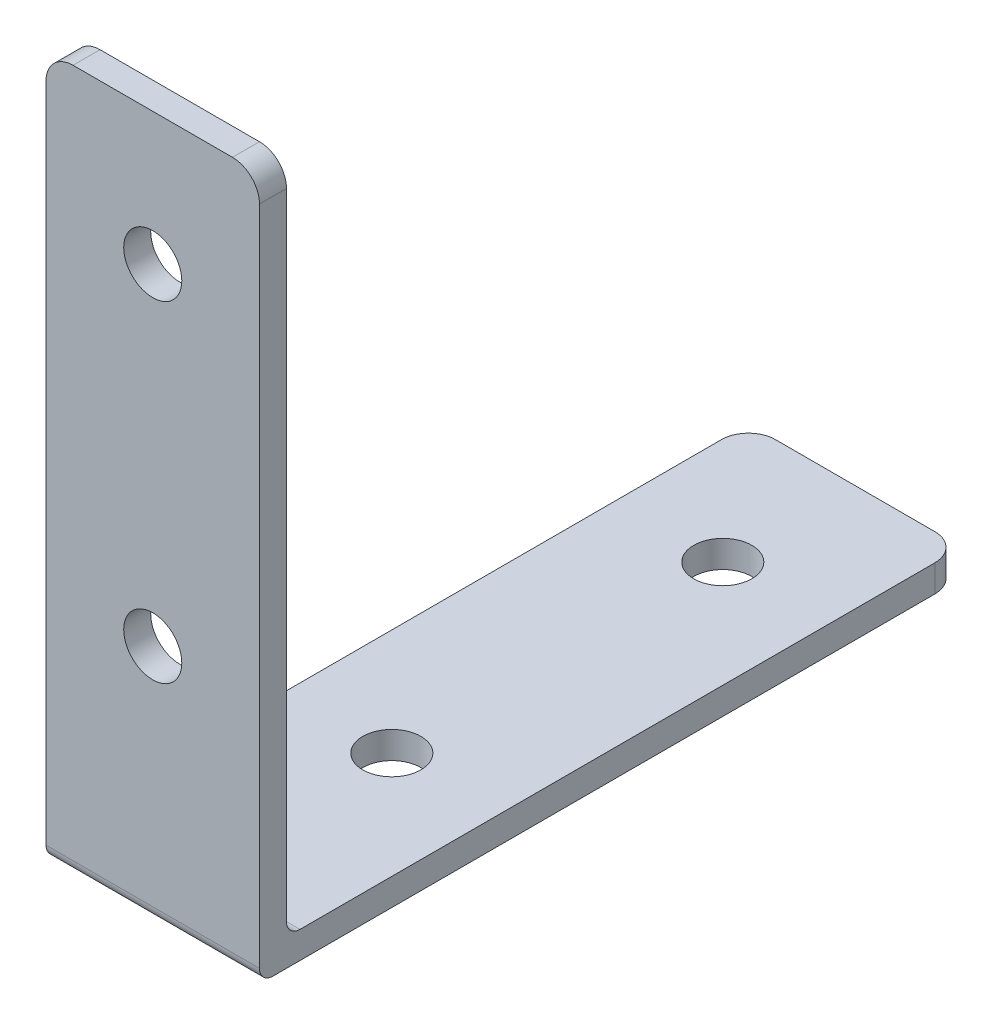
ISO-10303-21;
HEADER;
FILE_DESCRIPTION(('STEP AP214'),'2;1');
FILE_NAME('part.step','',(''),(''),'','','');
FILE_SCHEMA(('AUTOMOTIVE_DESIGN { 1 0 10303 214 1 1 1 1 }'));
ENDSEC;
DATA;
#1=APPLICATION_CONTEXT('core data for automotive mechanical design processes');
#2=APPLICATION_PROTOCOL_DEFINITION('international standard','automotive_design',2000,#1);
#3=PRODUCT_CONTEXT('',#1,'mechanical');
#4=PRODUCT('Part','Part','',(#3));
#5=PRODUCT_RELATED_PRODUCT_CATEGORY('part','',(#4));
#6=PRODUCT_DEFINITION_FORMATION('','',#4);
#7=PRODUCT_DEFINITION_CONTEXT('part definition',#1,'design');
#8=PRODUCT_DEFINITION('design','',#6,#7);
#9=PRODUCT_DEFINITION_SHAPE('','',#8);
#10=(LENGTH_UNIT() NAMED_UNIT(*) SI_UNIT(.MILLI.,.METRE.));
#11=(NAMED_UNIT(*) PLANE_ANGLE_UNIT() SI_UNIT($,.RADIAN.));
#12=(NAMED_UNIT(*) SI_UNIT($,.STERADIAN.) SOLID_ANGLE_UNIT());
#13=UNCERTAINTY_MEASURE_WITH_UNIT(LENGTH_MEASURE(1.E-05),#10,'distance_accuracy_value','');
#14=(GEOMETRIC_REPRESENTATION_CONTEXT(3) GLOBAL_UNCERTAINTY_ASSIGNED_CONTEXT((#13)) GLOBAL_UNIT_ASSIGNED_CONTEXT((#10,
#11,#12)) REPRESENTATION_CONTEXT('',''));
#15=CARTESIAN_POINT('',(0.,0.,0.));
#16=DIRECTION('',(0.,0.,1.));
#17=DIRECTION('',(1.,0.,0.));
#18=AXIS2_PLACEMENT_3D('',#15,#16,#17);
#19=CARTESIAN_POINT('',(0.,0.,51.));
#20=DIRECTION('',(-1.,0.,0.));
#21=DIRECTION('',(0.,-1.,0.));
#22=AXIS2_PLACEMENT_3D('',#19,#20,#21);
#23=CYLINDRICAL_SURFACE('',#22,1.);
#24=DIRECTION('',(1.,0.,0.));
#25=VECTOR('',#24,1.);
#26=CARTESIAN_POINT('',(0.,0.,52.));
#27=LINE('',#26,#25);
#28=CARTESIAN_POINT('',(-7.9,0.,52.));
#29=VERTEX_POINT('',#28);
#30=CARTESIAN_POINT('',(7.9,0.,52.));
#31=VERTEX_POINT('',#30);
#32=EDGE_CURVE('E130',#29,#31,#27,.T.);
#33=ORIENTED_EDGE('',*,*,#32,.F.);
#34=CARTESIAN_POINT('',(-7.9,0.,51.));
#35=DIRECTION('',(1.,0.,0.));
#36=DIRECTION('',(0.,0.,-1.));
#37=AXIS2_PLACEMENT_3D('',#34,#35,#36);
#38=CIRCLE('',#37,1.);
#39=CARTESIAN_POINT('',(-7.9,-1.,51.));
#40=VERTEX_POINT('',#39);
#41=EDGE_CURVE('E137',#40,#29,#38,.F.);
#42=ORIENTED_EDGE('',*,*,#41,.F.);
#43=DIRECTION('',(1.,0.,0.));
#44=VECTOR('',#43,1.);
#45=CARTESIAN_POINT('',(0.,-0.999999999999999,51.));
#46=LINE('',#45,#44);
#47=CARTESIAN_POINT('',(7.9,-0.999999999999999,51.));
#48=VERTEX_POINT('',#47);
#49=EDGE_CURVE('E147',#48,#40,#46,.F.);
#50=ORIENTED_EDGE('',*,*,#49,.F.);
#51=CARTESIAN_POINT('',(7.9,0.,51.));
#52=DIRECTION('',(-1.,0.,0.));
#53=DIRECTION('',(0.,0.,1.));
#54=AXIS2_PLACEMENT_3D('',#51,#52,#53);
#55=CIRCLE('',#54,1.);
#56=EDGE_CURVE('E146',#31,#48,#55,.F.);
#57=ORIENTED_EDGE('',*,*,#56,.F.);
#58=EDGE_LOOP('',(#33,#42,#50,#57));
#59=FACE_BOUND('',#58,.T.);
#60=ADVANCED_FACE('F33',(#59),#23,.T.);
#61=CARTESIAN_POINT('',(7.9,1.,52.));
#62=DIRECTION('',(0.,-1.,0.));
#63=DIRECTION('',(1.,0.,0.));
#64=AXIS2_PLACEMENT_3D('',#61,#62,#63);
#65=PLANE('',#64);
#66=CARTESIAN_POINT('',(0.,1.,9.8));
#67=DIRECTION('',(0.,1.,0.));
#68=DIRECTION('',(-1.,0.,0.));
#69=AXIS2_PLACEMENT_3D('',#66,#67,#68);
#70=CIRCLE('',#69,2.15);
#71=CARTESIAN_POINT('',(-2.15,1.,9.8));
#72=VERTEX_POINT('',#71);
#73=EDGE_CURVE('E199',#72,#72,#70,.T.);
#74=ORIENTED_EDGE('',*,*,#73,.F.);
#75=EDGE_LOOP('',(#74));
#76=FACE_BOUND('',#75,.T.);
#77=CARTESIAN_POINT('',(0.,1.,34.3));
#78=DIRECTION('',(0.,1.,0.));
#79=DIRECTION('',(-1.,0.,0.));
#80=AXIS2_PLACEMENT_3D('',#77,#78,#79);
#81=CIRCLE('',#80,2.15);
#82=CARTESIAN_POINT('',(-2.15,1.,34.3));
#83=VERTEX_POINT('',#82);
#84=EDGE_CURVE('E205',#83,#83,#81,.T.);
#85=ORIENTED_EDGE('',*,*,#84,.F.);
#86=EDGE_LOOP('',(#85));
#87=FACE_BOUND('',#86,.T.);
#88=DIRECTION('',(0.,0.,-1.));
#89=VECTOR('',#88,1.);
#90=CARTESIAN_POINT('',(7.9,1.,52.));
#91=LINE('',#90,#89);
#92=CARTESIAN_POINT('',(7.9,1.,49.));
#93=VERTEX_POINT('',#92);
#94=CARTESIAN_POINT('',(7.9,1.,2.00000000000002));
#95=VERTEX_POINT('',#94);
#96=EDGE_CURVE('E239',#93,#95,#91,.T.);
#97=ORIENTED_EDGE('',*,*,#96,.T.);
#98=CARTESIAN_POINT('',(5.9,1.,2.));
#99=DIRECTION('',(0.,-1.,0.));
#100=DIRECTION('',(1.,0.,0.));
#101=AXIS2_PLACEMENT_3D('',#98,#99,#100);
#102=CIRCLE('',#101,2.);
#103=CARTESIAN_POINT('',(5.9,1.,0.));
#104=VERTEX_POINT('',#103);
#105=EDGE_CURVE('E181',#95,#104,#102,.F.);
#106=ORIENTED_EDGE('',*,*,#105,.T.);
#107=DIRECTION('',(-1.,0.,0.));
#108=VECTOR('',#107,1.);
#109=CARTESIAN_POINT('',(7.9,1.,0.));
#110=LINE('',#109,#108);
#111=CARTESIAN_POINT('',(-5.9,1.,0.));
#112=VERTEX_POINT('',#111);
#113=EDGE_CURVE('E134',#104,#112,#110,.T.);
#114=ORIENTED_EDGE('',*,*,#113,.T.);
#115=CARTESIAN_POINT('',(-5.9,1.,2.));
#116=DIRECTION('',(0.,-1.,0.));
#117=DIRECTION('',(1.,0.,0.));
#118=AXIS2_PLACEMENT_3D('',#115,#116,#117);
#119=CIRCLE('',#118,2.);
#120=CARTESIAN_POINT('',(-7.9,1.,2.00000000000002));
#121=VERTEX_POINT('',#120);
#122=EDGE_CURVE('E179',#112,#121,#119,.F.);
#123=ORIENTED_EDGE('',*,*,#122,.T.);
#124=DIRECTION('',(0.,0.,-1.));
#125=VECTOR('',#124,1.);
#126=CARTESIAN_POINT('',(-7.9,1.,52.));
#127=LINE('',#126,#125);
#128=CARTESIAN_POINT('',(-7.9,1.,49.));
#129=VERTEX_POINT('',#128);
#130=EDGE_CURVE('E233',#129,#121,#127,.T.);
#131=ORIENTED_EDGE('',*,*,#130,.F.);
#132=DIRECTION('',(-1.,0.,0.));
#133=VECTOR('',#132,1.);
#134=CARTESIAN_POINT('',(7.9,1.,49.));
#135=LINE('',#134,#133);
#136=EDGE_CURVE('E159',#129,#93,#135,.F.);
#137=ORIENTED_EDGE('',*,*,#136,.T.);
#138=EDGE_LOOP('',(#97,#106,#114,#123,#131,#137));
#139=FACE_BOUND('',#138,.T.);
#140=ADVANCED_FACE('F254',(#76,#87,#139),#65,.F.);
#141=CARTESIAN_POINT('',(-7.9,-1.,52.));
#142=DIRECTION('',(1.,0.,0.));
#143=DIRECTION('',(0.,0.,-1.));
#144=AXIS2_PLACEMENT_3D('',#141,#142,#143);
#145=PLANE('',#144);
#146=ORIENTED_EDGE('',*,*,#130,.T.);
#147=DIRECTION('',(0.,-1.,0.));
#148=VECTOR('',#147,1.);
#149=CARTESIAN_POINT('',(-7.9,-1.,2.));
#150=LINE('',#149,#148);
#151=CARTESIAN_POINT('',(-7.9,-1.,2.00000000000002));
#152=VERTEX_POINT('',#151);
#153=EDGE_CURVE('E193',#121,#152,#150,.T.);
#154=ORIENTED_EDGE('',*,*,#153,.T.);
#155=DIRECTION('',(0.,0.,-1.));
#156=VECTOR('',#155,1.);
#157=CARTESIAN_POINT('',(-7.9,-1.,52.));
#158=LINE('',#157,#156);
#159=EDGE_CURVE('E142',#40,#152,#158,.T.);
#160=ORIENTED_EDGE('',*,*,#159,.F.);
#161=ORIENTED_EDGE('',*,*,#41,.T.);
#162=DIRECTION('',(0.,-1.,0.));
#163=VECTOR('',#162,1.);
#164=CARTESIAN_POINT('',(-7.9,-1.,52.));
#165=LINE('',#164,#163);
#166=CARTESIAN_POINT('',(-7.9,49.,52.));
#167=VERTEX_POINT('',#166);
#168=EDGE_CURVE('E124',#167,#29,#165,.T.);
#169=ORIENTED_EDGE('',*,*,#168,.F.);
#170=DIRECTION('',(0.,0.,1.));
#171=VECTOR('',#170,1.);
#172=CARTESIAN_POINT('',(-7.9,49.,52.));
#173=LINE('',#172,#171);
#174=CARTESIAN_POINT('',(-7.90000000000001,49.,50.));
#175=VERTEX_POINT('',#174);
#176=EDGE_CURVE('E191',#167,#175,#173,.F.);
#177=ORIENTED_EDGE('',*,*,#176,.T.);
#178=DIRECTION('',(0.,-1.,0.));
#179=VECTOR('',#178,1.);
#180=CARTESIAN_POINT('',(-7.90000000000001,51.,50.));
#181=LINE('',#180,#179);
#182=CARTESIAN_POINT('',(-7.9,2.,50.));
#183=VERTEX_POINT('',#182);
#184=EDGE_CURVE('E227',#175,#183,#181,.T.);
#185=ORIENTED_EDGE('',*,*,#184,.T.);
#186=CARTESIAN_POINT('',(-7.9,2.,49.));
#187=DIRECTION('',(1.,0.,0.));
#188=DIRECTION('',(0.,0.,-1.));
#189=AXIS2_PLACEMENT_3D('',#186,#187,#188);
#190=CIRCLE('',#189,1.);
#191=EDGE_CURVE('E161',#183,#129,#190,.T.);
#192=ORIENTED_EDGE('',*,*,#191,.T.);
#193=EDGE_LOOP('',(#146,#154,#160,#161,#169,#177,#185,#192));
#194=FACE_BOUND('',#193,.T.);
#195=ADVANCED_FACE('F139',(#194),#145,.F.);
#196=CARTESIAN_POINT('',(7.9,-0.999999999999999,52.));
#197=DIRECTION('',(0.,1.,0.));
#198=DIRECTION('',(-1.,0.,0.));
#199=AXIS2_PLACEMENT_3D('',#196,#197,#198);
#200=PLANE('',#199);
#201=CARTESIAN_POINT('',(0.,-1.,9.8));
#202=DIRECTION('',(0.,1.,0.));
#203=DIRECTION('',(-1.,0.,0.));
#204=AXIS2_PLACEMENT_3D('',#201,#202,#203);
#205=CIRCLE('',#204,2.15);
#206=CARTESIAN_POINT('',(-2.15,-1.,9.8));
#207=VERTEX_POINT('',#206);
#208=EDGE_CURVE('E37',#207,#207,#205,.T.);
#209=ORIENTED_EDGE('',*,*,#208,.T.);
#210=EDGE_LOOP('',(#209));
#211=FACE_BOUND('',#210,.T.);
#212=CARTESIAN_POINT('',(0.,-1.,34.3));
#213=DIRECTION('',(0.,1.,0.));
#214=DIRECTION('',(-1.,0.,0.));
#215=AXIS2_PLACEMENT_3D('',#212,#213,#214);
#216=CIRCLE('',#215,2.15);
#217=CARTESIAN_POINT('',(-2.15,-1.,34.3));
#218=VERTEX_POINT('',#217);
#219=EDGE_CURVE('E197',#218,#218,#216,.T.);
#220=ORIENTED_EDGE('',*,*,#219,.T.);
#221=EDGE_LOOP('',(#220));
#222=FACE_BOUND('',#221,.T.);
#223=DIRECTION('',(1.,0.,0.));
#224=VECTOR('',#223,1.);
#225=CARTESIAN_POINT('',(7.9,-0.999999999999999,0.));
#226=LINE('',#225,#224);
#227=CARTESIAN_POINT('',(-5.9,-1.,0.));
#228=VERTEX_POINT('',#227);
#229=CARTESIAN_POINT('',(5.9,-0.999999999999999,0.));
#230=VERTEX_POINT('',#229);
#231=EDGE_CURVE('E230',#228,#230,#226,.T.);
#232=ORIENTED_EDGE('',*,*,#231,.T.);
#233=CARTESIAN_POINT('',(5.9,-0.999999999999999,2.));
#234=DIRECTION('',(0.,1.,0.));
#235=DIRECTION('',(-1.,0.,0.));
#236=AXIS2_PLACEMENT_3D('',#233,#234,#235);
#237=CIRCLE('',#236,2.);
#238=CARTESIAN_POINT('',(7.9,-0.999999999999999,2.00000000000002));
#239=VERTEX_POINT('',#238);
#240=EDGE_CURVE('E189',#230,#239,#237,.F.);
#241=ORIENTED_EDGE('',*,*,#240,.T.);
#242=DIRECTION('',(0.,0.,-1.));
#243=VECTOR('',#242,1.);
#244=CARTESIAN_POINT('',(7.9,-0.999999999999999,52.));
#245=LINE('',#244,#243);
#246=EDGE_CURVE('E151',#48,#239,#245,.T.);
#247=ORIENTED_EDGE('',*,*,#246,.F.);
#248=ORIENTED_EDGE('',*,*,#49,.T.);
#249=ORIENTED_EDGE('',*,*,#159,.T.);
#250=CARTESIAN_POINT('',(-5.9,-1.,2.));
#251=DIRECTION('',(0.,1.,0.));
#252=DIRECTION('',(-1.,0.,0.));
#253=AXIS2_PLACEMENT_3D('',#250,#251,#252);
#254=CIRCLE('',#253,2.);
#255=EDGE_CURVE('E187',#152,#228,#254,.F.);
#256=ORIENTED_EDGE('',*,*,#255,.T.);
#257=EDGE_LOOP('',(#232,#241,#247,#248,#249,#256));
#258=FACE_BOUND('',#257,.T.);
#259=ADVANCED_FACE('F372',(#211,#222,#258),#200,.F.);
#260=CARTESIAN_POINT('',(7.9,-0.999999999999999,52.));
#261=DIRECTION('',(-1.,0.,0.));
#262=DIRECTION('',(0.,0.,1.));
#263=AXIS2_PLACEMENT_3D('',#260,#261,#262);
#264=PLANE('',#263);
#265=ORIENTED_EDGE('',*,*,#246,.T.);
#266=DIRECTION('',(0.,1.,0.));
#267=VECTOR('',#266,1.);
#268=CARTESIAN_POINT('',(7.9,-0.999999999999999,2.));
#269=LINE('',#268,#267);
#270=EDGE_CURVE('E176',#239,#95,#269,.T.);
#271=ORIENTED_EDGE('',*,*,#270,.T.);
#272=ORIENTED_EDGE('',*,*,#96,.F.);
#273=CARTESIAN_POINT('',(7.9,2.,49.));
#274=DIRECTION('',(-1.,0.,0.));
#275=DIRECTION('',(0.,0.,1.));
#276=AXIS2_PLACEMENT_3D('',#273,#274,#275);
#277=CIRCLE('',#276,1.);
#278=CARTESIAN_POINT('',(7.9,2.,50.));
#279=VERTEX_POINT('',#278);
#280=EDGE_CURVE('E163',#93,#279,#277,.T.);
#281=ORIENTED_EDGE('',*,*,#280,.T.);
#282=DIRECTION('',(0.,-1.,0.));
#283=VECTOR('',#282,1.);
#284=CARTESIAN_POINT('',(7.89999999999999,51.,50.));
#285=LINE('',#284,#283);
#286=CARTESIAN_POINT('',(7.89999999999999,49.,50.));
#287=VERTEX_POINT('',#286);
#288=EDGE_CURVE('E229',#287,#279,#285,.T.);
#289=ORIENTED_EDGE('',*,*,#288,.F.);
#290=DIRECTION('',(0.,0.,-1.));
#291=VECTOR('',#290,1.);
#292=CARTESIAN_POINT('',(7.9,49.,52.));
#293=LINE('',#292,#291);
#294=CARTESIAN_POINT('',(7.9,49.,52.));
#295=VERTEX_POINT('',#294);
#296=EDGE_CURVE('E171',#287,#295,#293,.F.);
#297=ORIENTED_EDGE('',*,*,#296,.T.);
#298=DIRECTION('',(0.,1.,0.));
#299=VECTOR('',#298,1.);
#300=CARTESIAN_POINT('',(7.9,-0.999999999999999,52.));
#301=LINE('',#300,#299);
#302=EDGE_CURVE('E133',#31,#295,#301,.T.);
#303=ORIENTED_EDGE('',*,*,#302,.F.);
#304=ORIENTED_EDGE('',*,*,#56,.T.);
#305=EDGE_LOOP('',(#265,#271,#272,#281,#289,#297,#303,#304));
#306=FACE_BOUND('',#305,.T.);
#307=ADVANCED_FACE('F245',(#306),#264,.F.);
#308=CARTESIAN_POINT('',(0.,0.,52.));
#309=DIRECTION('',(0.,0.,1.));
#310=DIRECTION('',(1.,0.,0.));
#311=AXIS2_PLACEMENT_3D('',#308,#309,#310);
#312=PLANE('',#311);
#313=CARTESIAN_POINT('',(0.,41.2,52.));
#314=DIRECTION('',(0.,0.,1.));
#315=DIRECTION('',(1.,0.,0.));
#316=AXIS2_PLACEMENT_3D('',#313,#314,#315);
#317=CIRCLE('',#316,2.15);
#318=CARTESIAN_POINT('',(2.15,41.2,52.));
#319=VERTEX_POINT('',#318);
#320=EDGE_CURVE('E220',#319,#319,#317,.T.);
#321=ORIENTED_EDGE('',*,*,#320,.F.);
#322=EDGE_LOOP('',(#321));
#323=FACE_BOUND('',#322,.T.);
#324=CARTESIAN_POINT('',(0.,16.7,52.));
#325=DIRECTION('',(0.,0.,1.));
#326=DIRECTION('',(1.,0.,0.));
#327=AXIS2_PLACEMENT_3D('',#324,#325,#326);
#328=CIRCLE('',#327,2.15);
#329=CARTESIAN_POINT('',(2.15,16.7,52.));
#330=VERTEX_POINT('',#329);
#331=EDGE_CURVE('E215',#330,#330,#328,.T.);
#332=ORIENTED_EDGE('',*,*,#331,.F.);
#333=EDGE_LOOP('',(#332));
#334=FACE_BOUND('',#333,.T.);
#335=DIRECTION('',(1.,0.,0.));
#336=VECTOR('',#335,1.);
#337=CARTESIAN_POINT('',(-7.90000000000001,51.,52.));
#338=LINE('',#337,#336);
#339=CARTESIAN_POINT('',(-5.9,51.,52.));
#340=VERTEX_POINT('',#339);
#341=CARTESIAN_POINT('',(5.9,51.,52.));
#342=VERTEX_POINT('',#341);
#343=EDGE_CURVE('E223',#340,#342,#338,.T.);
#344=ORIENTED_EDGE('',*,*,#343,.F.);
#345=CARTESIAN_POINT('',(-5.9,49.,52.));
#346=DIRECTION('',(0.,0.,1.));
#347=DIRECTION('',(1.,0.,0.));
#348=AXIS2_PLACEMENT_3D('',#345,#346,#347);
#349=CIRCLE('',#348,2.);
#350=EDGE_CURVE('E42',#340,#167,#349,.T.);
#351=ORIENTED_EDGE('',*,*,#350,.T.);
#352=ORIENTED_EDGE('',*,*,#168,.T.);
#353=ORIENTED_EDGE('',*,*,#32,.T.);
#354=ORIENTED_EDGE('',*,*,#302,.T.);
#355=CARTESIAN_POINT('',(5.9,49.,52.));
#356=DIRECTION('',(0.,0.,1.));
#357=DIRECTION('',(1.,0.,0.));
#358=AXIS2_PLACEMENT_3D('',#355,#356,#357);
#359=CIRCLE('',#358,2.);
#360=EDGE_CURVE('E173',#295,#342,#359,.T.);
#361=ORIENTED_EDGE('',*,*,#360,.T.);
#362=EDGE_LOOP('',(#344,#351,#352,#353,#354,#361));
#363=FACE_BOUND('',#362,.T.);
#364=ADVANCED_FACE('F127',(#323,#334,#363),#312,.T.);
#365=CARTESIAN_POINT('',(0.,0.,0.));
#366=DIRECTION('',(0.,0.,1.));
#367=DIRECTION('',(1.,0.,0.));
#368=AXIS2_PLACEMENT_3D('',#365,#366,#367);
#369=PLANE('',#368);
#370=ORIENTED_EDGE('',*,*,#113,.F.);
#371=DIRECTION('',(0.,1.,0.));
#372=VECTOR('',#371,1.);
#373=CARTESIAN_POINT('',(5.9,0.,0.));
#374=LINE('',#373,#372);
#375=EDGE_CURVE('E185',#104,#230,#374,.F.);
#376=ORIENTED_EDGE('',*,*,#375,.T.);
#377=ORIENTED_EDGE('',*,*,#231,.F.);
#378=DIRECTION('',(0.,-1.,0.));
#379=VECTOR('',#378,1.);
#380=CARTESIAN_POINT('',(-5.9,0.,0.));
#381=LINE('',#380,#379);
#382=EDGE_CURVE('E183',#228,#112,#381,.F.);
#383=ORIENTED_EDGE('',*,*,#382,.T.);
#384=EDGE_LOOP('',(#370,#376,#377,#383));
#385=FACE_BOUND('',#384,.T.);
#386=ADVANCED_FACE('F257',(#385),#369,.F.);
#387=CARTESIAN_POINT('',(-7.90000000000001,51.,50.));
#388=DIRECTION('',(0.,0.,1.));
#389=DIRECTION('',(1.,0.,0.));
#390=AXIS2_PLACEMENT_3D('',#387,#388,#389);
#391=PLANE('',#390);
#392=CARTESIAN_POINT('',(0.,41.2,50.));
#393=DIRECTION('',(0.,0.,-1.));
#394=DIRECTION('',(-1.,0.,0.));
#395=AXIS2_PLACEMENT_3D('',#392,#393,#394);
#396=CIRCLE('',#395,2.15);
#397=CARTESIAN_POINT('',(-2.15,41.2,50.));
#398=VERTEX_POINT('',#397);
#399=EDGE_CURVE('E212',#398,#398,#396,.T.);
#400=ORIENTED_EDGE('',*,*,#399,.F.);
#401=EDGE_LOOP('',(#400));
#402=FACE_BOUND('',#401,.T.);
#403=CARTESIAN_POINT('',(0.,16.7,50.));
#404=DIRECTION('',(0.,0.,-1.));
#405=DIRECTION('',(-1.,0.,0.));
#406=AXIS2_PLACEMENT_3D('',#403,#404,#405);
#407=CIRCLE('',#406,2.15);
#408=CARTESIAN_POINT('',(-2.15,16.7,50.));
#409=VERTEX_POINT('',#408);
#410=EDGE_CURVE('E203',#409,#409,#407,.T.);
#411=ORIENTED_EDGE('',*,*,#410,.F.);
#412=EDGE_LOOP('',(#411));
#413=FACE_BOUND('',#412,.T.);
#414=ORIENTED_EDGE('',*,*,#184,.F.);
#415=CARTESIAN_POINT('',(-5.9,49.,50.));
#416=DIRECTION('',(0.,0.,1.));
#417=DIRECTION('',(1.,0.,0.));
#418=AXIS2_PLACEMENT_3D('',#415,#416,#417);
#419=CIRCLE('',#418,2.);
#420=CARTESIAN_POINT('',(-5.9,51.,50.));
#421=VERTEX_POINT('',#420);
#422=EDGE_CURVE('E11',#175,#421,#419,.F.);
#423=ORIENTED_EDGE('',*,*,#422,.T.);
#424=DIRECTION('',(-1.,0.,0.));
#425=VECTOR('',#424,1.);
#426=CARTESIAN_POINT('',(-7.90000000000001,51.,50.));
#427=LINE('',#426,#425);
#428=CARTESIAN_POINT('',(5.9,51.,50.));
#429=VERTEX_POINT('',#428);
#430=EDGE_CURVE('E225',#429,#421,#427,.T.);
#431=ORIENTED_EDGE('',*,*,#430,.F.);
#432=CARTESIAN_POINT('',(5.9,49.,50.));
#433=DIRECTION('',(0.,0.,1.));
#434=DIRECTION('',(1.,0.,0.));
#435=AXIS2_PLACEMENT_3D('',#432,#433,#434);
#436=CIRCLE('',#435,2.);
#437=EDGE_CURVE('E169',#429,#287,#436,.F.);
#438=ORIENTED_EDGE('',*,*,#437,.T.);
#439=ORIENTED_EDGE('',*,*,#288,.T.);
#440=DIRECTION('',(-1.,0.,0.));
#441=VECTOR('',#440,1.);
#442=CARTESIAN_POINT('',(-7.9,2.,50.));
#443=LINE('',#442,#441);
#444=EDGE_CURVE('E156',#279,#183,#443,.T.);
#445=ORIENTED_EDGE('',*,*,#444,.T.);
#446=EDGE_LOOP('',(#414,#423,#431,#438,#439,#445));
#447=FACE_BOUND('',#446,.T.);
#448=ADVANCED_FACE('F270',(#402,#413,#447),#391,.F.);
#449=CARTESIAN_POINT('',(0.,51.,0.));
#450=DIRECTION('',(0.,-1.,0.));
#451=DIRECTION('',(1.,0.,0.));
#452=AXIS2_PLACEMENT_3D('',#449,#450,#451);
#453=PLANE('',#452);
#454=ORIENTED_EDGE('',*,*,#430,.T.);
#455=DIRECTION('',(0.,0.,1.));
#456=VECTOR('',#455,1.);
#457=CARTESIAN_POINT('',(-5.9,51.,0.));
#458=LINE('',#457,#456);
#459=EDGE_CURVE('E195',#421,#340,#458,.T.);
#460=ORIENTED_EDGE('',*,*,#459,.T.);
#461=ORIENTED_EDGE('',*,*,#343,.T.);
#462=DIRECTION('',(0.,0.,-1.));
#463=VECTOR('',#462,1.);
#464=CARTESIAN_POINT('',(5.9,51.,0.));
#465=LINE('',#464,#463);
#466=EDGE_CURVE('E166',#342,#429,#465,.T.);
#467=ORIENTED_EDGE('',*,*,#466,.T.);
#468=EDGE_LOOP('',(#454,#460,#461,#467));
#469=FACE_BOUND('',#468,.T.);
#470=ADVANCED_FACE('F278',(#469),#453,.F.);
#471=CARTESIAN_POINT('',(-7.9,2.,49.));
#472=DIRECTION('',(1.,0.,0.));
#473=DIRECTION('',(0.,1.,0.));
#474=AXIS2_PLACEMENT_3D('',#471,#472,#473);
#475=CYLINDRICAL_SURFACE('',#474,1.);
#476=ORIENTED_EDGE('',*,*,#280,.F.);
#477=ORIENTED_EDGE('',*,*,#136,.F.);
#478=ORIENTED_EDGE('',*,*,#191,.F.);
#479=ORIENTED_EDGE('',*,*,#444,.F.);
#480=EDGE_LOOP('',(#476,#477,#478,#479));
#481=FACE_BOUND('',#480,.T.);
#482=ADVANCED_FACE('F269',(#481),#475,.F.);
#483=CARTESIAN_POINT('',(5.9,49.,0.));
#484=DIRECTION('',(0.,0.,-1.));
#485=DIRECTION('',(-1.,0.,0.));
#486=AXIS2_PLACEMENT_3D('',#483,#484,#485);
#487=CYLINDRICAL_SURFACE('',#486,2.);
#488=ORIENTED_EDGE('',*,*,#360,.F.);
#489=ORIENTED_EDGE('',*,*,#296,.F.);
#490=ORIENTED_EDGE('',*,*,#437,.F.);
#491=ORIENTED_EDGE('',*,*,#466,.F.);
#492=EDGE_LOOP('',(#488,#489,#490,#491));
#493=FACE_BOUND('',#492,.T.);
#494=ADVANCED_FACE('F275',(#493),#487,.T.);
#495=CARTESIAN_POINT('',(5.9,-0.999999999999999,2.));
#496=DIRECTION('',(0.,1.,0.));
#497=DIRECTION('',(0.,0.,1.));
#498=AXIS2_PLACEMENT_3D('',#495,#496,#497);
#499=CYLINDRICAL_SURFACE('',#498,2.);
#500=ORIENTED_EDGE('',*,*,#240,.F.);
#501=ORIENTED_EDGE('',*,*,#375,.F.);
#502=ORIENTED_EDGE('',*,*,#105,.F.);
#503=ORIENTED_EDGE('',*,*,#270,.F.);
#504=EDGE_LOOP('',(#500,#501,#502,#503));
#505=FACE_BOUND('',#504,.T.);
#506=ADVANCED_FACE('F250',(#505),#499,.T.);
#507=CARTESIAN_POINT('',(-5.9,-1.,2.));
#508=DIRECTION('',(0.,-1.,0.));
#509=DIRECTION('',(0.,0.,-1.));
#510=AXIS2_PLACEMENT_3D('',#507,#508,#509);
#511=CYLINDRICAL_SURFACE('',#510,2.);
#512=ORIENTED_EDGE('',*,*,#122,.F.);
#513=ORIENTED_EDGE('',*,*,#382,.F.);
#514=ORIENTED_EDGE('',*,*,#255,.F.);
#515=ORIENTED_EDGE('',*,*,#153,.F.);
#516=EDGE_LOOP('',(#512,#513,#514,#515));
#517=FACE_BOUND('',#516,.T.);
#518=ADVANCED_FACE('F261',(#517),#511,.T.);
#519=CARTESIAN_POINT('',(-5.9,49.,0.));
#520=DIRECTION('',(0.,0.,1.));
#521=DIRECTION('',(1.,0.,0.));
#522=AXIS2_PLACEMENT_3D('',#519,#520,#521);
#523=CYLINDRICAL_SURFACE('',#522,2.);
#524=ORIENTED_EDGE('',*,*,#422,.F.);
#525=ORIENTED_EDGE('',*,*,#176,.F.);
#526=ORIENTED_EDGE('',*,*,#350,.F.);
#527=ORIENTED_EDGE('',*,*,#459,.F.);
#528=EDGE_LOOP('',(#524,#525,#526,#527));
#529=FACE_BOUND('',#528,.T.);
#530=ADVANCED_FACE('F35',(#529),#523,.T.);
#531=CARTESIAN_POINT('',(0.,16.7,100.));
#532=DIRECTION('',(0.,0.,-1.));
#533=DIRECTION('',(-1.,0.,0.));
#534=AXIS2_PLACEMENT_3D('',#531,#532,#533);
#535=CYLINDRICAL_SURFACE('',#534,2.15);
#536=ORIENTED_EDGE('',*,*,#331,.T.);
#537=EDGE_LOOP('',(#536));
#538=FACE_BOUND('',#537,.T.);
#539=ORIENTED_EDGE('',*,*,#410,.T.);
#540=EDGE_LOOP('',(#539));
#541=FACE_BOUND('',#540,.T.);
#542=ADVANCED_FACE('F280',(#538,#541),#535,.F.);
#543=CARTESIAN_POINT('',(0.,41.2,100.));
#544=DIRECTION('',(0.,0.,-1.));
#545=DIRECTION('',(-1.,0.,0.));
#546=AXIS2_PLACEMENT_3D('',#543,#544,#545);
#547=CYLINDRICAL_SURFACE('',#546,2.15);
#548=ORIENTED_EDGE('',*,*,#320,.T.);
#549=EDGE_LOOP('',(#548));
#550=FACE_BOUND('',#549,.T.);
#551=ORIENTED_EDGE('',*,*,#399,.T.);
#552=EDGE_LOOP('',(#551));
#553=FACE_BOUND('',#552,.T.);
#554=ADVANCED_FACE('F285',(#550,#553),#547,.F.);
#555=CARTESIAN_POINT('',(0.,-49.,34.3));
#556=DIRECTION('',(0.,1.,0.));
#557=DIRECTION('',(-1.,0.,0.));
#558=AXIS2_PLACEMENT_3D('',#555,#556,#557);
#559=CYLINDRICAL_SURFACE('',#558,2.15);
#560=ORIENTED_EDGE('',*,*,#84,.T.);
#561=EDGE_LOOP('',(#560));
#562=FACE_BOUND('',#561,.T.);
#563=ORIENTED_EDGE('',*,*,#219,.F.);
#564=EDGE_LOOP('',(#563));
#565=FACE_BOUND('',#564,.T.);
#566=ADVANCED_FACE('F355',(#562,#565),#559,.F.);
#567=CARTESIAN_POINT('',(0.,-49.,9.8));
#568=DIRECTION('',(0.,1.,0.));
#569=DIRECTION('',(-1.,0.,0.));
#570=AXIS2_PLACEMENT_3D('',#567,#568,#569);
#571=CYLINDRICAL_SURFACE('',#570,2.15);
#572=ORIENTED_EDGE('',*,*,#73,.T.);
#573=EDGE_LOOP('',(#572));
#574=FACE_BOUND('',#573,.T.);
#575=ORIENTED_EDGE('',*,*,#208,.F.);
#576=EDGE_LOOP('',(#575));
#577=FACE_BOUND('',#576,.T.);
#578=ADVANCED_FACE('F385',(#574,#577),#571,.F.);
#579=CLOSED_SHELL('',(#60,#140,#195,#259,#307,#364,#386,#448,#470,#482,#494,#506,#518,#530,#542,
#554,#566,#578));
#580=MANIFOLD_SOLID_BREP('B2',#579);
#581=ADVANCED_BREP_SHAPE_REPRESENTATION('',(#18,#580),#14);
#582=SHAPE_DEFINITION_REPRESENTATION(#9,#581);
ENDSEC;
END-ISO-10303-21;
